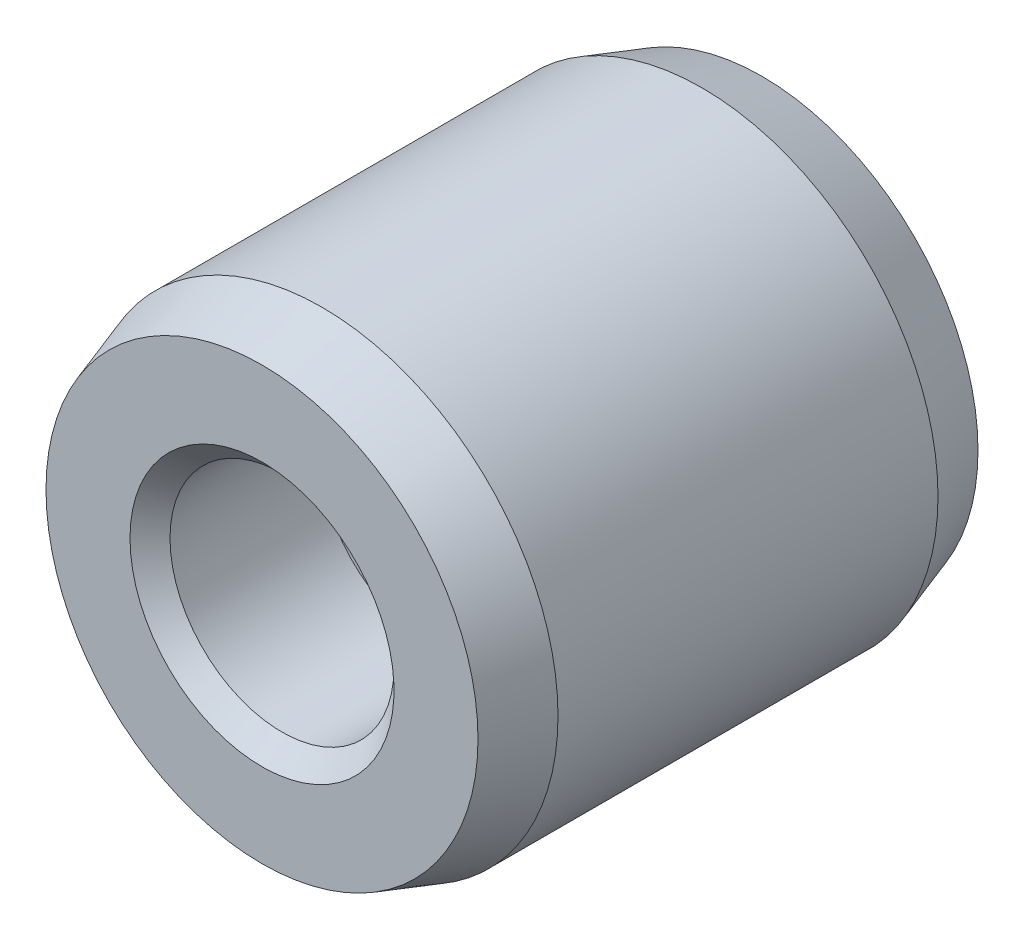
ISO-10303-21;
HEADER;
FILE_DESCRIPTION(('STEP AP214'),'2;1');
FILE_NAME('part.step','',(''),(''),'','','');
FILE_SCHEMA(('AUTOMOTIVE_DESIGN { 1 0 10303 214 1 1 1 1 }'));
ENDSEC;
DATA;
#1=APPLICATION_CONTEXT('core data for automotive mechanical design processes');
#2=APPLICATION_PROTOCOL_DEFINITION('international standard','automotive_design',2000,#1);
#3=PRODUCT_CONTEXT('',#1,'mechanical');
#4=PRODUCT('Part','Part','',(#3));
#5=PRODUCT_RELATED_PRODUCT_CATEGORY('part','',(#4));
#6=PRODUCT_DEFINITION_FORMATION('','',#4);
#7=PRODUCT_DEFINITION_CONTEXT('part definition',#1,'design');
#8=PRODUCT_DEFINITION('design','',#6,#7);
#9=PRODUCT_DEFINITION_SHAPE('','',#8);
#10=(LENGTH_UNIT() NAMED_UNIT(*) SI_UNIT(.MILLI.,.METRE.));
#11=(NAMED_UNIT(*) PLANE_ANGLE_UNIT() SI_UNIT($,.RADIAN.));
#12=(NAMED_UNIT(*) SI_UNIT($,.STERADIAN.) SOLID_ANGLE_UNIT());
#13=UNCERTAINTY_MEASURE_WITH_UNIT(LENGTH_MEASURE(1.E-05),#10,'distance_accuracy_value','');
#14=(GEOMETRIC_REPRESENTATION_CONTEXT(3) GLOBAL_UNCERTAINTY_ASSIGNED_CONTEXT((#13)) GLOBAL_UNIT_ASSIGNED_CONTEXT((#10,
#11,#12)) REPRESENTATION_CONTEXT('',''));
#15=CARTESIAN_POINT('',(0.,0.,0.));
#16=DIRECTION('',(0.,0.,1.));
#17=DIRECTION('',(1.,0.,0.));
#18=AXIS2_PLACEMENT_3D('',#15,#16,#17);
#19=CARTESIAN_POINT('',(0.,2.7432,3.175));
#20=DIRECTION('',(0.,0.,-1.));
#21=DIRECTION('',(-1.,0.,0.));
#22=AXIS2_PLACEMENT_3D('',#19,#20,#21);
#23=PLANE('',#22);
#24=CARTESIAN_POINT('',(0.,0.,3.175));
#25=DIRECTION('',(0.,0.,-1.));
#26=DIRECTION('',(-1.,0.,0.));
#27=AXIS2_PLACEMENT_3D('',#24,#25,#26);
#28=CIRCLE('',#27,1.6764);
#29=CARTESIAN_POINT('',(-1.6764,0.,3.175));
#30=VERTEX_POINT('',#29);
#31=EDGE_CURVE('E10',#30,#30,#28,.T.);
#32=ORIENTED_EDGE('',*,*,#31,.T.);
#33=EDGE_LOOP('',(#32));
#34=FACE_BOUND('',#33,.T.);
#35=CARTESIAN_POINT('',(0.,0.,3.175));
#36=DIRECTION('',(0.,0.,1.));
#37=DIRECTION('',(1.,0.,0.));
#38=AXIS2_PLACEMENT_3D('',#35,#36,#37);
#39=CIRCLE('',#38,2.7432);
#40=CARTESIAN_POINT('',(2.7432,0.,3.175));
#41=VERTEX_POINT('',#40);
#42=EDGE_CURVE('E43',#41,#41,#39,.T.);
#43=ORIENTED_EDGE('',*,*,#42,.T.);
#44=EDGE_LOOP('',(#43));
#45=FACE_BOUND('',#44,.T.);
#46=ADVANCED_FACE('F14',(#34,#45),#23,.F.);
#47=CARTESIAN_POINT('',(0.,0.,-3.175));
#48=DIRECTION('',(0.,0.,1.));
#49=DIRECTION('',(1.,0.,0.));
#50=AXIS2_PLACEMENT_3D('',#47,#48,#49);
#51=PLANE('',#50);
#52=CARTESIAN_POINT('',(0.,0.,-3.175));
#53=DIRECTION('',(0.,0.,1.));
#54=DIRECTION('',(1.,0.,0.));
#55=AXIS2_PLACEMENT_3D('',#52,#53,#54);
#56=CIRCLE('',#55,1.6764);
#57=CARTESIAN_POINT('',(1.6764,0.,-3.175));
#58=VERTEX_POINT('',#57);
#59=EDGE_CURVE('E25',#58,#58,#56,.T.);
#60=ORIENTED_EDGE('',*,*,#59,.T.);
#61=EDGE_LOOP('',(#60));
#62=FACE_BOUND('',#61,.T.);
#63=CARTESIAN_POINT('',(0.,0.,-3.175));
#64=DIRECTION('',(0.,0.,1.));
#65=DIRECTION('',(1.,0.,0.));
#66=AXIS2_PLACEMENT_3D('',#63,#64,#65);
#67=CIRCLE('',#66,2.7432);
#68=CARTESIAN_POINT('',(2.7432,0.,-3.175));
#69=VERTEX_POINT('',#68);
#70=EDGE_CURVE('E34',#69,#69,#67,.T.);
#71=ORIENTED_EDGE('',*,*,#70,.F.);
#72=EDGE_LOOP('',(#71));
#73=FACE_BOUND('',#72,.T.);
#74=ADVANCED_FACE('F75',(#62,#73),#51,.F.);
#75=CARTESIAN_POINT('',(0.,0.,-3.175));
#76=DIRECTION('',(0.,0.,1.));
#77=DIRECTION('',(1.,0.,0.));
#78=AXIS2_PLACEMENT_3D('',#75,#76,#77);
#79=CONICAL_SURFACE('',#78,2.7432,0.321750554396642);
#80=CARTESIAN_POINT('',(0.,0.,-2.413));
#81=DIRECTION('',(0.,0.,1.));
#82=DIRECTION('',(1.,0.,0.));
#83=AXIS2_PLACEMENT_3D('',#80,#81,#82);
#84=CIRCLE('',#83,2.9972);
#85=CARTESIAN_POINT('',(2.9972,0.,-2.413));
#86=VERTEX_POINT('',#85);
#87=EDGE_CURVE('E37',#86,#86,#84,.T.);
#88=ORIENTED_EDGE('',*,*,#87,.F.);
#89=EDGE_LOOP('',(#88));
#90=FACE_BOUND('',#89,.T.);
#91=ORIENTED_EDGE('',*,*,#70,.T.);
#92=EDGE_LOOP('',(#91));
#93=FACE_BOUND('',#92,.T.);
#94=ADVANCED_FACE('F80',(#90,#93),#79,.T.);
#95=CARTESIAN_POINT('',(0.,0.,3.175));
#96=DIRECTION('',(0.,0.,1.));
#97=DIRECTION('',(1.,0.,0.));
#98=AXIS2_PLACEMENT_3D('',#95,#96,#97);
#99=CYLINDRICAL_SURFACE('',#98,2.9972);
#100=CARTESIAN_POINT('',(0.,0.,2.413));
#101=DIRECTION('',(0.,0.,1.));
#102=DIRECTION('',(1.,0.,0.));
#103=AXIS2_PLACEMENT_3D('',#100,#101,#102);
#104=CIRCLE('',#103,2.9972);
#105=CARTESIAN_POINT('',(2.9972,0.,2.413));
#106=VERTEX_POINT('',#105);
#107=EDGE_CURVE('E40',#106,#106,#104,.T.);
#108=ORIENTED_EDGE('',*,*,#107,.F.);
#109=EDGE_LOOP('',(#108));
#110=FACE_BOUND('',#109,.T.);
#111=ORIENTED_EDGE('',*,*,#87,.T.);
#112=EDGE_LOOP('',(#111));
#113=FACE_BOUND('',#112,.T.);
#114=ADVANCED_FACE('F87',(#110,#113),#99,.T.);
#115=CARTESIAN_POINT('',(0.,0.,2.413));
#116=DIRECTION('',(0.,0.,-1.));
#117=DIRECTION('',(-1.,0.,0.));
#118=AXIS2_PLACEMENT_3D('',#115,#116,#117);
#119=CONICAL_SURFACE('',#118,2.9972,0.321750554396642);
#120=ORIENTED_EDGE('',*,*,#42,.F.);
#121=EDGE_LOOP('',(#120));
#122=FACE_BOUND('',#121,.T.);
#123=ORIENTED_EDGE('',*,*,#107,.T.);
#124=EDGE_LOOP('',(#123));
#125=FACE_BOUND('',#124,.T.);
#126=ADVANCED_FACE('F91',(#122,#125),#119,.T.);
#127=CARTESIAN_POINT('',(0.,0.,-3.175));
#128=DIRECTION('',(0.,0.,-1.));
#129=DIRECTION('',(-1.,0.,0.));
#130=AXIS2_PLACEMENT_3D('',#127,#128,#129);
#131=CYLINDRICAL_SURFACE('',#130,1.1303);
#132=CARTESIAN_POINT('',(0.,0.,1.016));
#133=DIRECTION('',(0.,0.,1.));
#134=DIRECTION('',(1.,0.,0.));
#135=AXIS2_PLACEMENT_3D('',#132,#133,#134);
#136=CIRCLE('',#135,1.1303);
#137=CARTESIAN_POINT('',(1.1303,0.,1.016));
#138=VERTEX_POINT('',#137);
#139=EDGE_CURVE('E52',#138,#138,#136,.T.);
#140=ORIENTED_EDGE('',*,*,#139,.T.);
#141=EDGE_LOOP('',(#140));
#142=FACE_BOUND('',#141,.T.);
#143=CARTESIAN_POINT('',(0.,0.,-1.016));
#144=DIRECTION('',(0.,0.,-1.));
#145=DIRECTION('',(-1.,0.,0.));
#146=AXIS2_PLACEMENT_3D('',#143,#144,#145);
#147=CIRCLE('',#146,1.1303);
#148=CARTESIAN_POINT('',(-1.1303,0.,-1.016));
#149=VERTEX_POINT('',#148);
#150=EDGE_CURVE('E46',#149,#149,#147,.T.);
#151=ORIENTED_EDGE('',*,*,#150,.T.);
#152=EDGE_LOOP('',(#151));
#153=FACE_BOUND('',#152,.T.);
#154=ADVANCED_FACE('F95',(#142,#153),#131,.F.);
#155=CARTESIAN_POINT('',(1.1303,0.,-1.016));
#156=DIRECTION('',(0.,0.,1.));
#157=DIRECTION('',(1.,0.,0.));
#158=AXIS2_PLACEMENT_3D('',#155,#156,#157);
#159=PLANE('',#158);
#160=ORIENTED_EDGE('',*,*,#150,.F.);
#161=EDGE_LOOP('',(#160));
#162=FACE_BOUND('',#161,.T.);
#163=CARTESIAN_POINT('',(0.,0.,-1.016));
#164=DIRECTION('',(0.,0.,-1.));
#165=DIRECTION('',(-1.,0.,0.));
#166=AXIS2_PLACEMENT_3D('',#163,#164,#165);
#167=CIRCLE('',#166,1.4224);
#168=CARTESIAN_POINT('',(-1.4224,0.,-1.016));
#169=VERTEX_POINT('',#168);
#170=EDGE_CURVE('E49',#169,#169,#167,.T.);
#171=ORIENTED_EDGE('',*,*,#170,.T.);
#172=EDGE_LOOP('',(#171));
#173=FACE_BOUND('',#172,.T.);
#174=ADVANCED_FACE('F99',(#162,#173),#159,.F.);
#175=CARTESIAN_POINT('',(0.,0.,-3.175));
#176=DIRECTION('',(0.,0.,-1.));
#177=DIRECTION('',(-1.,0.,0.));
#178=AXIS2_PLACEMENT_3D('',#175,#176,#177);
#179=CYLINDRICAL_SURFACE('',#178,1.4224);
#180=CARTESIAN_POINT('',(0.,0.,-2.921));
#181=DIRECTION('',(0.,0.,1.));
#182=DIRECTION('',(1.,0.,0.));
#183=AXIS2_PLACEMENT_3D('',#180,#181,#182);
#184=CIRCLE('',#183,1.4224);
#185=CARTESIAN_POINT('',(1.4224,0.,-2.921));
#186=VERTEX_POINT('',#185);
#187=EDGE_CURVE('E29',#186,#186,#184,.F.);
#188=ORIENTED_EDGE('',*,*,#187,.T.);
#189=EDGE_LOOP('',(#188));
#190=FACE_BOUND('',#189,.T.);
#191=ORIENTED_EDGE('',*,*,#170,.F.);
#192=EDGE_LOOP('',(#191));
#193=FACE_BOUND('',#192,.T.);
#194=ADVANCED_FACE('F71',(#190,#193),#179,.F.);
#195=CARTESIAN_POINT('',(1.1303,0.,1.016));
#196=DIRECTION('',(0.,0.,-1.));
#197=DIRECTION('',(-1.,0.,0.));
#198=AXIS2_PLACEMENT_3D('',#195,#196,#197);
#199=PLANE('',#198);
#200=ORIENTED_EDGE('',*,*,#139,.F.);
#201=EDGE_LOOP('',(#200));
#202=FACE_BOUND('',#201,.T.);
#203=CARTESIAN_POINT('',(0.,0.,1.016));
#204=DIRECTION('',(0.,0.,1.));
#205=DIRECTION('',(1.,0.,0.));
#206=AXIS2_PLACEMENT_3D('',#203,#204,#205);
#207=CIRCLE('',#206,1.4224);
#208=CARTESIAN_POINT('',(1.4224,0.,1.016));
#209=VERTEX_POINT('',#208);
#210=EDGE_CURVE('E55',#209,#209,#207,.T.);
#211=ORIENTED_EDGE('',*,*,#210,.T.);
#212=EDGE_LOOP('',(#211));
#213=FACE_BOUND('',#212,.T.);
#214=ADVANCED_FACE('F59',(#202,#213),#199,.F.);
#215=CARTESIAN_POINT('',(0.,0.,3.175));
#216=DIRECTION('',(0.,0.,1.));
#217=DIRECTION('',(1.,0.,0.));
#218=AXIS2_PLACEMENT_3D('',#215,#216,#217);
#219=CYLINDRICAL_SURFACE('',#218,1.4224);
#220=CARTESIAN_POINT('',(0.,0.,2.921));
#221=DIRECTION('',(0.,0.,-1.));
#222=DIRECTION('',(-1.,0.,0.));
#223=AXIS2_PLACEMENT_3D('',#220,#221,#222);
#224=CIRCLE('',#223,1.4224);
#225=CARTESIAN_POINT('',(-1.4224,0.,2.921));
#226=VERTEX_POINT('',#225);
#227=EDGE_CURVE('E21',#226,#226,#224,.F.);
#228=ORIENTED_EDGE('',*,*,#227,.T.);
#229=EDGE_LOOP('',(#228));
#230=FACE_BOUND('',#229,.T.);
#231=ORIENTED_EDGE('',*,*,#210,.F.);
#232=EDGE_LOOP('',(#231));
#233=FACE_BOUND('',#232,.T.);
#234=ADVANCED_FACE('F61',(#230,#233),#219,.F.);
#235=CARTESIAN_POINT('',(0.,0.,-2.921));
#236=DIRECTION('',(0.,0.,-1.));
#237=DIRECTION('',(-1.,0.,0.));
#238=AXIS2_PLACEMENT_3D('',#235,#236,#237);
#239=CONICAL_SURFACE('',#238,1.4224,0.785398163397451);
#240=ORIENTED_EDGE('',*,*,#59,.F.);
#241=EDGE_LOOP('',(#240));
#242=FACE_BOUND('',#241,.T.);
#243=ORIENTED_EDGE('',*,*,#187,.F.);
#244=EDGE_LOOP('',(#243));
#245=FACE_BOUND('',#244,.T.);
#246=ADVANCED_FACE('F63',(#242,#245),#239,.F.);
#247=CARTESIAN_POINT('',(0.,0.,2.921));
#248=DIRECTION('',(0.,0.,1.));
#249=DIRECTION('',(1.,0.,0.));
#250=AXIS2_PLACEMENT_3D('',#247,#248,#249);
#251=CONICAL_SURFACE('',#250,1.4224,0.785398163397447);
#252=ORIENTED_EDGE('',*,*,#31,.F.);
#253=EDGE_LOOP('',(#252));
#254=FACE_BOUND('',#253,.T.);
#255=ORIENTED_EDGE('',*,*,#227,.F.);
#256=EDGE_LOOP('',(#255));
#257=FACE_BOUND('',#256,.T.);
#258=ADVANCED_FACE('F16',(#254,#257),#251,.F.);
#259=CLOSED_SHELL('',(#46,#74,#94,#114,#126,#154,#174,#194,#214,#234,#246,#258));
#260=MANIFOLD_SOLID_BREP('B1',#259);
#261=ADVANCED_BREP_SHAPE_REPRESENTATION('',(#18,#260),#14);
#262=SHAPE_DEFINITION_REPRESENTATION(#9,#261);
ENDSEC;
END-ISO-10303-21;
